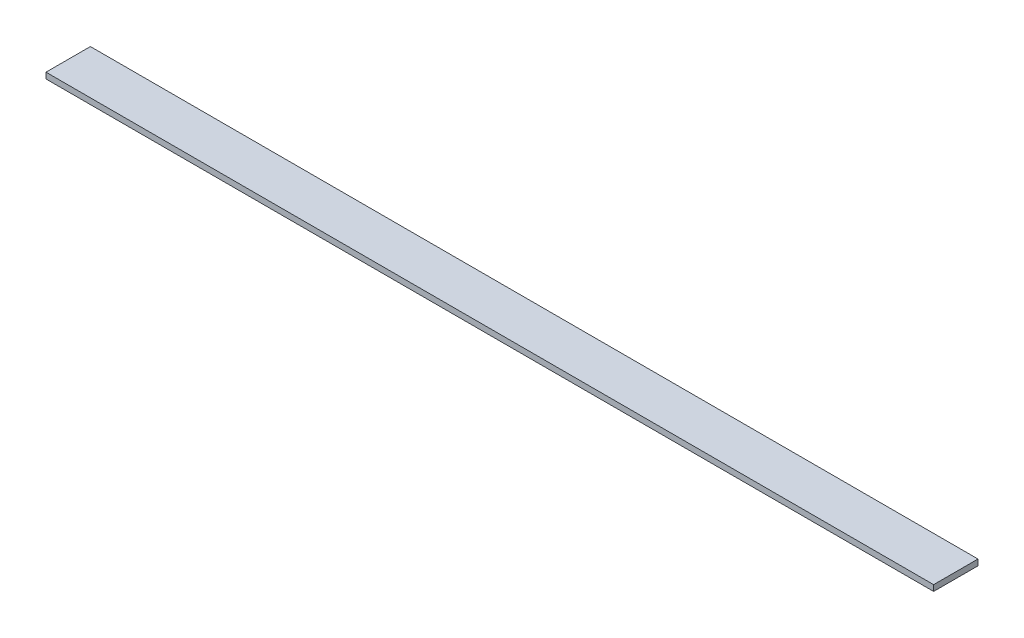
ISO-10303-21;
HEADER;
FILE_DESCRIPTION(('STEP AP214'),'2;1');
FILE_NAME('part.step','',(''),(''),'','','');
FILE_SCHEMA(('AUTOMOTIVE_DESIGN { 1 0 10303 214 1 1 1 1 }'));
ENDSEC;
DATA;
#1=APPLICATION_CONTEXT('core data for automotive mechanical design processes');
#2=APPLICATION_PROTOCOL_DEFINITION('international standard','automotive_design',2000,#1);
#3=PRODUCT_CONTEXT('',#1,'mechanical');
#4=PRODUCT('Part','Part','',(#3));
#5=PRODUCT_RELATED_PRODUCT_CATEGORY('part','',(#4));
#6=PRODUCT_DEFINITION_FORMATION('','',#4);
#7=PRODUCT_DEFINITION_CONTEXT('part definition',#1,'design');
#8=PRODUCT_DEFINITION('design','',#6,#7);
#9=PRODUCT_DEFINITION_SHAPE('','',#8);
#10=(LENGTH_UNIT() NAMED_UNIT(*) SI_UNIT(.MILLI.,.METRE.));
#11=(NAMED_UNIT(*) PLANE_ANGLE_UNIT() SI_UNIT($,.RADIAN.));
#12=(NAMED_UNIT(*) SI_UNIT($,.STERADIAN.) SOLID_ANGLE_UNIT());
#13=UNCERTAINTY_MEASURE_WITH_UNIT(LENGTH_MEASURE(1.E-05),#10,'distance_accuracy_value','');
#14=(GEOMETRIC_REPRESENTATION_CONTEXT(3) GLOBAL_UNCERTAINTY_ASSIGNED_CONTEXT((#13)) GLOBAL_UNIT_ASSIGNED_CONTEXT((#10,
#11,#12)) REPRESENTATION_CONTEXT('',''));
#15=CARTESIAN_POINT('',(0.,0.,0.));
#16=DIRECTION('',(0.,0.,1.));
#17=DIRECTION('',(1.,0.,0.));
#18=AXIS2_PLACEMENT_3D('',#15,#16,#17);
#19=CARTESIAN_POINT('',(300.,1.,-7.5));
#20=DIRECTION('',(0.,0.,1.));
#21=DIRECTION('',(0.,-1.,0.));
#22=AXIS2_PLACEMENT_3D('',#19,#20,#21);
#23=PLANE('',#22);
#24=DIRECTION('',(0.,1.,0.));
#25=VECTOR('',#24,1.);
#26=CARTESIAN_POINT('',(0.,1.,-7.5));
#27=LINE('',#26,#25);
#28=CARTESIAN_POINT('',(0.,-1.,-7.5));
#29=VERTEX_POINT('',#28);
#30=CARTESIAN_POINT('',(0.,1.,-7.5));
#31=VERTEX_POINT('',#30);
#32=EDGE_CURVE('E111',#29,#31,#27,.T.);
#33=ORIENTED_EDGE('',*,*,#32,.T.);
#34=DIRECTION('',(-1.,0.,0.));
#35=VECTOR('',#34,1.);
#36=CARTESIAN_POINT('',(300.,1.,-7.5));
#37=LINE('',#36,#35);
#38=CARTESIAN_POINT('',(300.,1.,-7.5));
#39=VERTEX_POINT('',#38);
#40=EDGE_CURVE('E11',#39,#31,#37,.T.);
#41=ORIENTED_EDGE('',*,*,#40,.F.);
#42=DIRECTION('',(0.,1.,0.));
#43=VECTOR('',#42,1.);
#44=CARTESIAN_POINT('',(300.,1.,-7.5));
#45=LINE('',#44,#43);
#46=CARTESIAN_POINT('',(300.,-1.,-7.5));
#47=VERTEX_POINT('',#46);
#48=EDGE_CURVE('E95',#47,#39,#45,.T.);
#49=ORIENTED_EDGE('',*,*,#48,.F.);
#50=DIRECTION('',(-1.,0.,0.));
#51=VECTOR('',#50,1.);
#52=CARTESIAN_POINT('',(300.,-1.,-7.5));
#53=LINE('',#52,#51);
#54=EDGE_CURVE('E107',#47,#29,#53,.T.);
#55=ORIENTED_EDGE('',*,*,#54,.T.);
#56=EDGE_LOOP('',(#33,#41,#49,#55));
#57=FACE_BOUND('',#56,.T.);
#58=ADVANCED_FACE('F43',(#57),#23,.F.);
#59=CARTESIAN_POINT('',(300.,1.,7.5));
#60=DIRECTION('',(0.,-1.,0.));
#61=DIRECTION('',(0.,0.,-1.));
#62=AXIS2_PLACEMENT_3D('',#59,#60,#61);
#63=PLANE('',#62);
#64=DIRECTION('',(0.,0.,1.));
#65=VECTOR('',#64,1.);
#66=CARTESIAN_POINT('',(0.,1.,7.5));
#67=LINE('',#66,#65);
#68=CARTESIAN_POINT('',(0.,1.,7.5));
#69=VERTEX_POINT('',#68);
#70=EDGE_CURVE('E100',#31,#69,#67,.T.);
#71=ORIENTED_EDGE('',*,*,#70,.T.);
#72=DIRECTION('',(-1.,0.,0.));
#73=VECTOR('',#72,1.);
#74=CARTESIAN_POINT('',(300.,1.,7.5));
#75=LINE('',#74,#73);
#76=CARTESIAN_POINT('',(300.,1.,7.5));
#77=VERTEX_POINT('',#76);
#78=EDGE_CURVE('E52',#77,#69,#75,.T.);
#79=ORIENTED_EDGE('',*,*,#78,.F.);
#80=DIRECTION('',(0.,0.,1.));
#81=VECTOR('',#80,1.);
#82=CARTESIAN_POINT('',(300.,1.,7.5));
#83=LINE('',#82,#81);
#84=EDGE_CURVE('E90',#39,#77,#83,.T.);
#85=ORIENTED_EDGE('',*,*,#84,.F.);
#86=ORIENTED_EDGE('',*,*,#40,.T.);
#87=EDGE_LOOP('',(#71,#79,#85,#86));
#88=FACE_BOUND('',#87,.T.);
#89=ADVANCED_FACE('F99',(#88),#63,.F.);
#90=CARTESIAN_POINT('',(300.,1.,7.5));
#91=DIRECTION('',(0.,0.,-1.));
#92=DIRECTION('',(-1.,0.,0.));
#93=AXIS2_PLACEMENT_3D('',#90,#91,#92);
#94=PLANE('',#93);
#95=DIRECTION('',(0.,-1.,0.));
#96=VECTOR('',#95,1.);
#97=CARTESIAN_POINT('',(0.,1.,7.5));
#98=LINE('',#97,#96);
#99=CARTESIAN_POINT('',(0.,-1.,7.5));
#100=VERTEX_POINT('',#99);
#101=EDGE_CURVE('E77',#69,#100,#98,.T.);
#102=ORIENTED_EDGE('',*,*,#101,.T.);
#103=DIRECTION('',(-1.,0.,0.));
#104=VECTOR('',#103,1.);
#105=CARTESIAN_POINT('',(300.,-1.,7.5));
#106=LINE('',#105,#104);
#107=CARTESIAN_POINT('',(300.,-1.,7.5));
#108=VERTEX_POINT('',#107);
#109=EDGE_CURVE('E102',#108,#100,#106,.T.);
#110=ORIENTED_EDGE('',*,*,#109,.F.);
#111=DIRECTION('',(0.,-1.,0.));
#112=VECTOR('',#111,1.);
#113=CARTESIAN_POINT('',(300.,1.,7.5));
#114=LINE('',#113,#112);
#115=EDGE_CURVE('E93',#77,#108,#114,.T.);
#116=ORIENTED_EDGE('',*,*,#115,.F.);
#117=ORIENTED_EDGE('',*,*,#78,.T.);
#118=EDGE_LOOP('',(#102,#110,#116,#117));
#119=FACE_BOUND('',#118,.T.);
#120=ADVANCED_FACE('F103',(#119),#94,.F.);
#121=CARTESIAN_POINT('',(300.,-1.,7.5));
#122=DIRECTION('',(0.,1.,0.));
#123=DIRECTION('',(0.,0.,1.));
#124=AXIS2_PLACEMENT_3D('',#121,#122,#123);
#125=PLANE('',#124);
#126=DIRECTION('',(0.,0.,-1.));
#127=VECTOR('',#126,1.);
#128=CARTESIAN_POINT('',(0.,-1.,7.5));
#129=LINE('',#128,#127);
#130=EDGE_CURVE('E83',#100,#29,#129,.T.);
#131=ORIENTED_EDGE('',*,*,#130,.T.);
#132=ORIENTED_EDGE('',*,*,#54,.F.);
#133=DIRECTION('',(0.,0.,-1.));
#134=VECTOR('',#133,1.);
#135=CARTESIAN_POINT('',(300.,-1.,7.5));
#136=LINE('',#135,#134);
#137=EDGE_CURVE('E60',#108,#47,#136,.T.);
#138=ORIENTED_EDGE('',*,*,#137,.F.);
#139=ORIENTED_EDGE('',*,*,#109,.T.);
#140=EDGE_LOOP('',(#131,#132,#138,#139));
#141=FACE_BOUND('',#140,.T.);
#142=ADVANCED_FACE('F124',(#141),#125,.F.);
#143=CARTESIAN_POINT('',(300.,0.,0.));
#144=DIRECTION('',(1.,0.,0.));
#145=DIRECTION('',(0.,0.,-1.));
#146=AXIS2_PLACEMENT_3D('',#143,#144,#145);
#147=PLANE('',#146);
#148=ORIENTED_EDGE('',*,*,#48,.T.);
#149=ORIENTED_EDGE('',*,*,#84,.T.);
#150=ORIENTED_EDGE('',*,*,#115,.T.);
#151=ORIENTED_EDGE('',*,*,#137,.T.);
#152=EDGE_LOOP('',(#148,#149,#150,#151));
#153=FACE_BOUND('',#152,.T.);
#154=ADVANCED_FACE('F91',(#153),#147,.T.);
#155=CARTESIAN_POINT('',(0.,0.,0.));
#156=DIRECTION('',(1.,0.,0.));
#157=DIRECTION('',(0.,0.,-1.));
#158=AXIS2_PLACEMENT_3D('',#155,#156,#157);
#159=PLANE('',#158);
#160=ORIENTED_EDGE('',*,*,#32,.F.);
#161=ORIENTED_EDGE('',*,*,#130,.F.);
#162=ORIENTED_EDGE('',*,*,#101,.F.);
#163=ORIENTED_EDGE('',*,*,#70,.F.);
#164=EDGE_LOOP('',(#160,#161,#162,#163));
#165=FACE_BOUND('',#164,.T.);
#166=ADVANCED_FACE('F127',(#165),#159,.F.);
#167=CLOSED_SHELL('',(#58,#89,#120,#142,#154,#166));
#168=MANIFOLD_SOLID_BREP('B2',#167);
#169=ADVANCED_BREP_SHAPE_REPRESENTATION('',(#18,#168),#14);
#170=SHAPE_DEFINITION_REPRESENTATION(#9,#169);
ENDSEC;
END-ISO-10303-21;
